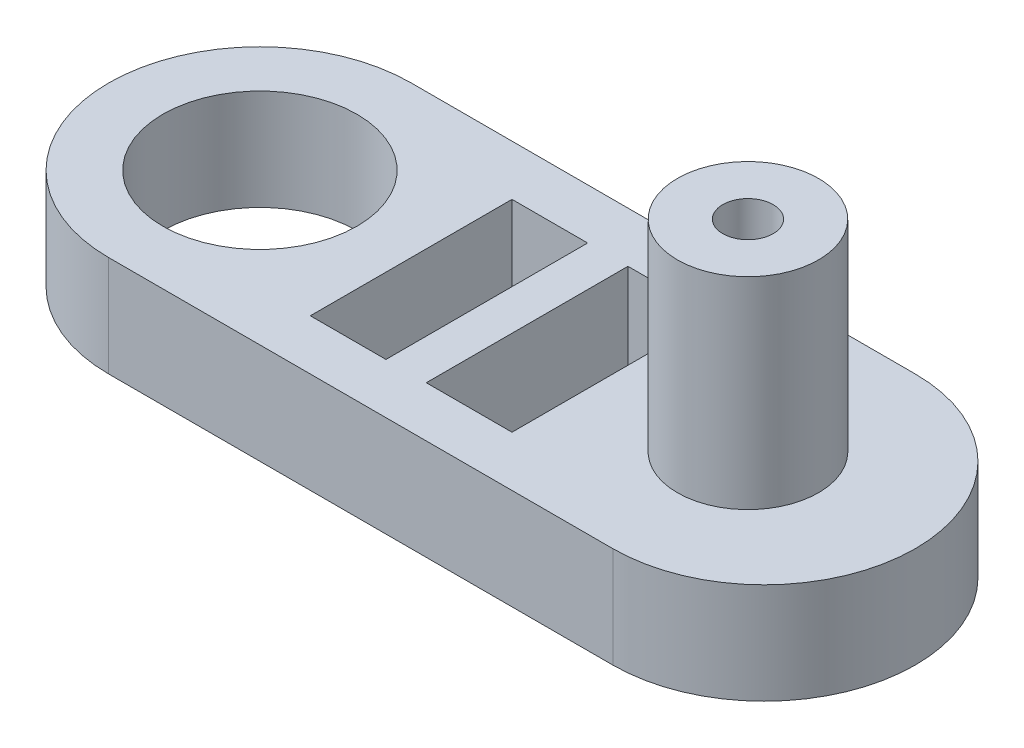
ISO-10303-21;
HEADER;
FILE_DESCRIPTION(('STEP AP214'),'2;1');
FILE_NAME('part.step','',(''),(''),'','','');
FILE_SCHEMA(('AUTOMOTIVE_DESIGN { 1 0 10303 214 1 1 1 1 }'));
ENDSEC;
DATA;
#1=APPLICATION_CONTEXT('core data for automotive mechanical design processes');
#2=APPLICATION_PROTOCOL_DEFINITION('international standard','automotive_design',2000,#1);
#3=PRODUCT_CONTEXT('',#1,'mechanical');
#4=PRODUCT('Part','Part','',(#3));
#5=PRODUCT_RELATED_PRODUCT_CATEGORY('part','',(#4));
#6=PRODUCT_DEFINITION_FORMATION('','',#4);
#7=PRODUCT_DEFINITION_CONTEXT('part definition',#1,'design');
#8=PRODUCT_DEFINITION('design','',#6,#7);
#9=PRODUCT_DEFINITION_SHAPE('','',#8);
#10=(LENGTH_UNIT() NAMED_UNIT(*) SI_UNIT(.MILLI.,.METRE.));
#11=(NAMED_UNIT(*) PLANE_ANGLE_UNIT() SI_UNIT($,.RADIAN.));
#12=(NAMED_UNIT(*) SI_UNIT($,.STERADIAN.) SOLID_ANGLE_UNIT());
#13=UNCERTAINTY_MEASURE_WITH_UNIT(LENGTH_MEASURE(1.E-05),#10,'distance_accuracy_value','');
#14=(GEOMETRIC_REPRESENTATION_CONTEXT(3) GLOBAL_UNCERTAINTY_ASSIGNED_CONTEXT((#13)) GLOBAL_UNIT_ASSIGNED_CONTEXT((#10,
#11,#12)) REPRESENTATION_CONTEXT('',''));
#15=CARTESIAN_POINT('',(0.,0.,0.));
#16=DIRECTION('',(0.,0.,1.));
#17=DIRECTION('',(1.,0.,0.));
#18=AXIS2_PLACEMENT_3D('',#15,#16,#17);
#19=CARTESIAN_POINT('',(-33.4000143814819,0.,-10.));
#20=DIRECTION('',(0.,0.,-1.));
#21=DIRECTION('',(-1.,0.,0.));
#22=AXIS2_PLACEMENT_3D('',#19,#20,#21);
#23=PLANE('',#22);
#24=DIRECTION('',(0.,1.,0.));
#25=VECTOR('',#24,1.);
#26=CARTESIAN_POINT('',(-21.9000143814819,10.,-10.));
#27=LINE('',#26,#25);
#28=CARTESIAN_POINT('',(-21.9000143814819,0.,-10.));
#29=VERTEX_POINT('',#28);
#30=CARTESIAN_POINT('',(-21.9000143814819,10.,-10.));
#31=VERTEX_POINT('',#30);
#32=EDGE_CURVE('E131',#29,#31,#27,.T.);
#33=ORIENTED_EDGE('',*,*,#32,.F.);
#34=DIRECTION('',(-1.,0.,0.));
#35=VECTOR('',#34,1.);
#36=CARTESIAN_POINT('',(-33.4000143814819,0.,-10.));
#37=LINE('',#36,#35);
#38=CARTESIAN_POINT('',(-13.4000143814819,0.,-10.));
#39=VERTEX_POINT('',#38);
#40=EDGE_CURVE('E167',#39,#29,#37,.T.);
#41=ORIENTED_EDGE('',*,*,#40,.F.);
#42=DIRECTION('',(0.,1.,0.));
#43=VECTOR('',#42,1.);
#44=CARTESIAN_POINT('',(-13.4000143814819,0.,-10.));
#45=LINE('',#44,#43);
#46=CARTESIAN_POINT('',(-13.4000143814819,10.,-10.));
#47=VERTEX_POINT('',#46);
#48=EDGE_CURVE('E159',#39,#47,#45,.T.);
#49=ORIENTED_EDGE('',*,*,#48,.T.);
#50=DIRECTION('',(-1.,0.,0.));
#51=VECTOR('',#50,1.);
#52=CARTESIAN_POINT('',(-33.4000143814819,10.,-10.));
#53=LINE('',#52,#51);
#54=EDGE_CURVE('E146',#47,#31,#53,.T.);
#55=ORIENTED_EDGE('',*,*,#54,.T.);
#56=EDGE_LOOP('',(#33,#41,#49,#55));
#57=FACE_BOUND('',#56,.T.);
#58=ADVANCED_FACE('F35',(#57),#23,.F.);
#59=DIRECTION('',(0.,-1.,0.));
#60=VECTOR('',#59,1.);
#61=CARTESIAN_POINT('',(-25.9000143814819,10.,-10.));
#62=LINE('',#61,#60);
#63=CARTESIAN_POINT('',(-25.9000143814819,10.,-10.));
#64=VERTEX_POINT('',#63);
#65=CARTESIAN_POINT('',(-25.9000143814819,0.,-10.));
#66=VERTEX_POINT('',#65);
#67=EDGE_CURVE('E50',#64,#66,#62,.T.);
#68=ORIENTED_EDGE('',*,*,#67,.F.);
#69=CARTESIAN_POINT('',(-33.4000143814819,10.,-10.));
#70=VERTEX_POINT('',#69);
#71=EDGE_CURVE('E137',#64,#70,#53,.T.);
#72=ORIENTED_EDGE('',*,*,#71,.T.);
#73=DIRECTION('',(0.,1.,0.));
#74=VECTOR('',#73,1.);
#75=CARTESIAN_POINT('',(-33.4000143814819,0.,-10.));
#76=LINE('',#75,#74);
#77=CARTESIAN_POINT('',(-33.4000143814819,0.,-10.));
#78=VERTEX_POINT('',#77);
#79=EDGE_CURVE('E156',#78,#70,#76,.T.);
#80=ORIENTED_EDGE('',*,*,#79,.F.);
#81=EDGE_CURVE('E139',#66,#78,#37,.T.);
#82=ORIENTED_EDGE('',*,*,#81,.F.);
#83=EDGE_LOOP('',(#68,#72,#80,#82));
#84=FACE_BOUND('',#83,.T.);
#85=ADVANCED_FACE('F135',(#84),#23,.F.);
#86=CARTESIAN_POINT('',(-33.4000143814819,0.,10.));
#87=DIRECTION('',(0.,0.,1.));
#88=DIRECTION('',(1.,0.,0.));
#89=AXIS2_PLACEMENT_3D('',#86,#87,#88);
#90=PLANE('',#89);
#91=DIRECTION('',(0.,1.,0.));
#92=VECTOR('',#91,1.);
#93=CARTESIAN_POINT('',(-21.9000143814819,10.,10.));
#94=LINE('',#93,#92);
#95=CARTESIAN_POINT('',(-21.9000143814819,0.,10.));
#96=VERTEX_POINT('',#95);
#97=CARTESIAN_POINT('',(-21.9000143814819,10.,10.));
#98=VERTEX_POINT('',#97);
#99=EDGE_CURVE('E400',#96,#98,#94,.T.);
#100=ORIENTED_EDGE('',*,*,#99,.T.);
#101=DIRECTION('',(1.,0.,0.));
#102=VECTOR('',#101,1.);
#103=CARTESIAN_POINT('',(-33.4000143814819,10.,10.));
#104=LINE('',#103,#102);
#105=CARTESIAN_POINT('',(-13.4000143814819,10.,10.));
#106=VERTEX_POINT('',#105);
#107=EDGE_CURVE('E413',#98,#106,#104,.T.);
#108=ORIENTED_EDGE('',*,*,#107,.T.);
#109=DIRECTION('',(0.,1.,0.));
#110=VECTOR('',#109,1.);
#111=CARTESIAN_POINT('',(-13.4000143814819,0.,10.));
#112=LINE('',#111,#110);
#113=CARTESIAN_POINT('',(-13.4000143814819,0.,10.));
#114=VERTEX_POINT('',#113);
#115=EDGE_CURVE('E161',#114,#106,#112,.T.);
#116=ORIENTED_EDGE('',*,*,#115,.F.);
#117=DIRECTION('',(1.,0.,0.));
#118=VECTOR('',#117,1.);
#119=CARTESIAN_POINT('',(-33.4000143814819,0.,10.));
#120=LINE('',#119,#118);
#121=EDGE_CURVE('E406',#96,#114,#120,.T.);
#122=ORIENTED_EDGE('',*,*,#121,.F.);
#123=EDGE_LOOP('',(#100,#108,#116,#122));
#124=FACE_BOUND('',#123,.T.);
#125=ADVANCED_FACE('F231',(#124),#90,.F.);
#126=DIRECTION('',(0.,-1.,0.));
#127=VECTOR('',#126,1.);
#128=CARTESIAN_POINT('',(-25.9000143814819,10.,10.));
#129=LINE('',#128,#127);
#130=CARTESIAN_POINT('',(-25.9000143814819,10.,10.));
#131=VERTEX_POINT('',#130);
#132=CARTESIAN_POINT('',(-25.9000143814819,0.,10.));
#133=VERTEX_POINT('',#132);
#134=EDGE_CURVE('E125',#131,#133,#129,.T.);
#135=ORIENTED_EDGE('',*,*,#134,.T.);
#136=CARTESIAN_POINT('',(-33.4000143814819,0.,10.));
#137=VERTEX_POINT('',#136);
#138=EDGE_CURVE('E398',#137,#133,#120,.T.);
#139=ORIENTED_EDGE('',*,*,#138,.F.);
#140=DIRECTION('',(0.,1.,0.));
#141=VECTOR('',#140,1.);
#142=CARTESIAN_POINT('',(-33.4000143814819,0.,10.));
#143=LINE('',#142,#141);
#144=CARTESIAN_POINT('',(-33.4000143814819,10.,10.));
#145=VERTEX_POINT('',#144);
#146=EDGE_CURVE('E164',#137,#145,#143,.T.);
#147=ORIENTED_EDGE('',*,*,#146,.T.);
#148=EDGE_CURVE('E152',#145,#131,#104,.T.);
#149=ORIENTED_EDGE('',*,*,#148,.T.);
#150=EDGE_LOOP('',(#135,#139,#147,#149));
#151=FACE_BOUND('',#150,.T.);
#152=ADVANCED_FACE('F244',(#151),#90,.F.);
#153=CARTESIAN_POINT('',(-48.4000143814819,10.,0.));
#154=DIRECTION('',(0.,1.,0.));
#155=DIRECTION('',(0.,0.,1.));
#156=AXIS2_PLACEMENT_3D('',#153,#154,#155);
#157=PLANE('',#156);
#158=CARTESIAN_POINT('',(0.,10.,0.));
#159=DIRECTION('',(0.,1.,0.));
#160=DIRECTION('',(0.,0.,1.));
#161=AXIS2_PLACEMENT_3D('',#158,#159,#160);
#162=CIRCLE('',#161,7.);
#163=CARTESIAN_POINT('',(0.,10.,7.));
#164=VERTEX_POINT('',#163);
#165=EDGE_CURVE('E429',#164,#164,#162,.T.);
#166=ORIENTED_EDGE('',*,*,#165,.F.);
#167=EDGE_LOOP('',(#166));
#168=FACE_BOUND('',#167,.T.);
#169=ORIENTED_EDGE('',*,*,#71,.F.);
#170=DIRECTION('',(0.,0.,-1.));
#171=VECTOR('',#170,1.);
#172=CARTESIAN_POINT('',(-25.9000143814819,10.,15.002));
#173=LINE('',#172,#171);
#174=EDGE_CURVE('E122',#131,#64,#173,.T.);
#175=ORIENTED_EDGE('',*,*,#174,.F.);
#176=ORIENTED_EDGE('',*,*,#148,.F.);
#177=DIRECTION('',(0.,0.,1.));
#178=VECTOR('',#177,1.);
#179=CARTESIAN_POINT('',(-33.4000143814819,10.,-10.));
#180=LINE('',#179,#178);
#181=EDGE_CURVE('E145',#70,#145,#180,.T.);
#182=ORIENTED_EDGE('',*,*,#181,.F.);
#183=EDGE_LOOP('',(#169,#175,#176,#182));
#184=FACE_BOUND('',#183,.T.);
#185=DIRECTION('',(0.,0.,-1.));
#186=VECTOR('',#185,1.);
#187=CARTESIAN_POINT('',(-21.9000143814819,10.,15.002));
#188=LINE('',#187,#186);
#189=EDGE_CURVE('E130',#98,#31,#188,.T.);
#190=ORIENTED_EDGE('',*,*,#189,.T.);
#191=ORIENTED_EDGE('',*,*,#54,.F.);
#192=DIRECTION('',(0.,0.,-1.));
#193=VECTOR('',#192,1.);
#194=CARTESIAN_POINT('',(-13.4000143814819,10.,-10.));
#195=LINE('',#194,#193);
#196=EDGE_CURVE('E147',#106,#47,#195,.T.);
#197=ORIENTED_EDGE('',*,*,#196,.F.);
#198=ORIENTED_EDGE('',*,*,#107,.F.);
#199=EDGE_LOOP('',(#190,#191,#197,#198));
#200=FACE_BOUND('',#199,.T.);
#201=CARTESIAN_POINT('',(-48.4000143814819,10.,0.));
#202=DIRECTION('',(0.,1.,0.));
#203=DIRECTION('',(0.,0.,1.));
#204=AXIS2_PLACEMENT_3D('',#201,#202,#203);
#205=CIRCLE('',#204,15.);
#206=CARTESIAN_POINT('',(-48.4000143814819,10.,-15.));
#207=VERTEX_POINT('',#206);
#208=CARTESIAN_POINT('',(-48.4000143814819,10.,15.));
#209=VERTEX_POINT('',#208);
#210=EDGE_CURVE('E174',#207,#209,#205,.T.);
#211=ORIENTED_EDGE('',*,*,#210,.T.);
#212=DIRECTION('',(1.,0.,0.));
#213=VECTOR('',#212,1.);
#214=CARTESIAN_POINT('',(-48.4000143814819,10.,15.));
#215=LINE('',#214,#213);
#216=CARTESIAN_POINT('',(1.59998561851808,10.,15.));
#217=VERTEX_POINT('',#216);
#218=EDGE_CURVE('E177',#209,#217,#215,.T.);
#219=ORIENTED_EDGE('',*,*,#218,.T.);
#220=CARTESIAN_POINT('',(1.59998561851808,10.,0.));
#221=DIRECTION('',(0.,1.,0.));
#222=DIRECTION('',(0.,0.,1.));
#223=AXIS2_PLACEMENT_3D('',#220,#221,#222);
#224=CIRCLE('',#223,15.);
#225=CARTESIAN_POINT('',(1.59998561851808,10.,-15.));
#226=VERTEX_POINT('',#225);
#227=EDGE_CURVE('E180',#217,#226,#224,.T.);
#228=ORIENTED_EDGE('',*,*,#227,.T.);
#229=DIRECTION('',(-1.,0.,0.));
#230=VECTOR('',#229,1.);
#231=CARTESIAN_POINT('',(-48.4000143814819,10.,-15.));
#232=LINE('',#231,#230);
#233=EDGE_CURVE('E182',#226,#207,#232,.T.);
#234=ORIENTED_EDGE('',*,*,#233,.T.);
#235=EDGE_LOOP('',(#211,#219,#228,#234));
#236=FACE_BOUND('',#235,.T.);
#237=CARTESIAN_POINT('',(-48.4000143814819,10.,0.));
#238=DIRECTION('',(0.,1.,0.));
#239=DIRECTION('',(0.,0.,1.));
#240=AXIS2_PLACEMENT_3D('',#237,#238,#239);
#241=CIRCLE('',#240,9.625);
#242=CARTESIAN_POINT('',(-48.4000143814819,10.,9.625));
#243=VERTEX_POINT('',#242);
#244=EDGE_CURVE('E168',#243,#243,#241,.T.);
#245=ORIENTED_EDGE('',*,*,#244,.F.);
#246=EDGE_LOOP('',(#245));
#247=FACE_BOUND('',#246,.T.);
#248=ADVANCED_FACE('F143',(#168,#184,#200,#236,#247),#157,.T.);
#249=CARTESIAN_POINT('',(-48.4000143814819,0.,0.));
#250=DIRECTION('',(0.,1.,0.));
#251=DIRECTION('',(0.,0.,1.));
#252=AXIS2_PLACEMENT_3D('',#249,#250,#251);
#253=PLANE('',#252);
#254=ORIENTED_EDGE('',*,*,#40,.T.);
#255=DIRECTION('',(0.,0.,-1.));
#256=VECTOR('',#255,1.);
#257=CARTESIAN_POINT('',(-21.9000143814819,0.,15.002));
#258=LINE('',#257,#256);
#259=EDGE_CURVE('E58',#96,#29,#258,.T.);
#260=ORIENTED_EDGE('',*,*,#259,.F.);
#261=ORIENTED_EDGE('',*,*,#121,.T.);
#262=DIRECTION('',(0.,0.,-1.));
#263=VECTOR('',#262,1.);
#264=CARTESIAN_POINT('',(-13.4000143814819,0.,-10.));
#265=LINE('',#264,#263);
#266=EDGE_CURVE('E405',#114,#39,#265,.T.);
#267=ORIENTED_EDGE('',*,*,#266,.T.);
#268=EDGE_LOOP('',(#254,#260,#261,#267));
#269=FACE_BOUND('',#268,.T.);
#270=DIRECTION('',(0.,0.,-1.));
#271=VECTOR('',#270,1.);
#272=CARTESIAN_POINT('',(-25.9000143814819,0.,15.002));
#273=LINE('',#272,#271);
#274=EDGE_CURVE('E401',#133,#66,#273,.T.);
#275=ORIENTED_EDGE('',*,*,#274,.T.);
#276=ORIENTED_EDGE('',*,*,#81,.T.);
#277=DIRECTION('',(0.,0.,1.));
#278=VECTOR('',#277,1.);
#279=CARTESIAN_POINT('',(-33.4000143814819,0.,-10.));
#280=LINE('',#279,#278);
#281=EDGE_CURVE('E150',#78,#137,#280,.T.);
#282=ORIENTED_EDGE('',*,*,#281,.T.);
#283=ORIENTED_EDGE('',*,*,#138,.T.);
#284=EDGE_LOOP('',(#275,#276,#282,#283));
#285=FACE_BOUND('',#284,.T.);
#286=CARTESIAN_POINT('',(-48.4000143814819,0.,0.));
#287=DIRECTION('',(0.,1.,0.));
#288=DIRECTION('',(0.,0.,1.));
#289=AXIS2_PLACEMENT_3D('',#286,#287,#288);
#290=CIRCLE('',#289,15.);
#291=CARTESIAN_POINT('',(-48.4000143814819,0.,-15.));
#292=VERTEX_POINT('',#291);
#293=CARTESIAN_POINT('',(-48.4000143814819,0.,15.));
#294=VERTEX_POINT('',#293);
#295=EDGE_CURVE('E171',#292,#294,#290,.T.);
#296=ORIENTED_EDGE('',*,*,#295,.F.);
#297=DIRECTION('',(-1.,0.,0.));
#298=VECTOR('',#297,1.);
#299=CARTESIAN_POINT('',(-48.4000143814819,0.,-15.));
#300=LINE('',#299,#298);
#301=CARTESIAN_POINT('',(1.59998561851808,0.,-15.));
#302=VERTEX_POINT('',#301);
#303=EDGE_CURVE('E178',#302,#292,#300,.T.);
#304=ORIENTED_EDGE('',*,*,#303,.F.);
#305=CARTESIAN_POINT('',(1.59998561851808,0.,0.));
#306=DIRECTION('',(0.,1.,0.));
#307=DIRECTION('',(0.,0.,1.));
#308=AXIS2_PLACEMENT_3D('',#305,#306,#307);
#309=CIRCLE('',#308,15.);
#310=CARTESIAN_POINT('',(1.59998561851808,0.,15.));
#311=VERTEX_POINT('',#310);
#312=EDGE_CURVE('E189',#311,#302,#309,.T.);
#313=ORIENTED_EDGE('',*,*,#312,.F.);
#314=DIRECTION('',(1.,0.,0.));
#315=VECTOR('',#314,1.);
#316=CARTESIAN_POINT('',(-48.4000143814819,0.,15.));
#317=LINE('',#316,#315);
#318=EDGE_CURVE('E187',#294,#311,#317,.T.);
#319=ORIENTED_EDGE('',*,*,#318,.F.);
#320=EDGE_LOOP('',(#296,#304,#313,#319));
#321=FACE_BOUND('',#320,.T.);
#322=CARTESIAN_POINT('',(-48.4000143814819,0.,0.));
#323=DIRECTION('',(0.,1.,0.));
#324=DIRECTION('',(0.,0.,1.));
#325=AXIS2_PLACEMENT_3D('',#322,#323,#324);
#326=CIRCLE('',#325,9.625);
#327=CARTESIAN_POINT('',(-48.4000143814819,0.,9.625));
#328=VERTEX_POINT('',#327);
#329=EDGE_CURVE('E158',#328,#328,#326,.T.);
#330=ORIENTED_EDGE('',*,*,#329,.T.);
#331=EDGE_LOOP('',(#330));
#332=FACE_BOUND('',#331,.T.);
#333=ADVANCED_FACE('F207',(#269,#285,#321,#332),#253,.F.);
#334=CARTESIAN_POINT('',(-48.4000143814819,10.,0.));
#335=DIRECTION('',(0.,-1.,0.));
#336=DIRECTION('',(0.,0.,-1.));
#337=AXIS2_PLACEMENT_3D('',#334,#335,#336);
#338=CYLINDRICAL_SURFACE('',#337,15.);
#339=ORIENTED_EDGE('',*,*,#295,.T.);
#340=DIRECTION('',(0.,-1.,0.));
#341=VECTOR('',#340,1.);
#342=CARTESIAN_POINT('',(-48.4000143814819,10.,15.));
#343=LINE('',#342,#341);
#344=EDGE_CURVE('E11',#209,#294,#343,.T.);
#345=ORIENTED_EDGE('',*,*,#344,.F.);
#346=ORIENTED_EDGE('',*,*,#210,.F.);
#347=DIRECTION('',(0.,-1.,0.));
#348=VECTOR('',#347,1.);
#349=CARTESIAN_POINT('',(-48.4000143814819,10.,-15.));
#350=LINE('',#349,#348);
#351=EDGE_CURVE('E184',#207,#292,#350,.T.);
#352=ORIENTED_EDGE('',*,*,#351,.T.);
#353=EDGE_LOOP('',(#339,#345,#346,#352));
#354=FACE_BOUND('',#353,.T.);
#355=ADVANCED_FACE('F37',(#354),#338,.T.);
#356=CARTESIAN_POINT('',(-48.4000143814819,10.,15.));
#357=DIRECTION('',(0.,0.,-1.));
#358=DIRECTION('',(-1.,0.,0.));
#359=AXIS2_PLACEMENT_3D('',#356,#357,#358);
#360=PLANE('',#359);
#361=ORIENTED_EDGE('',*,*,#318,.T.);
#362=DIRECTION('',(0.,-1.,0.));
#363=VECTOR('',#362,1.);
#364=CARTESIAN_POINT('',(1.59998561851808,10.,15.));
#365=LINE('',#364,#363);
#366=EDGE_CURVE('E43',#217,#311,#365,.T.);
#367=ORIENTED_EDGE('',*,*,#366,.F.);
#368=ORIENTED_EDGE('',*,*,#218,.F.);
#369=ORIENTED_EDGE('',*,*,#344,.T.);
#370=EDGE_LOOP('',(#361,#367,#368,#369));
#371=FACE_BOUND('',#370,.T.);
#372=ADVANCED_FACE('F218',(#371),#360,.F.);
#373=CARTESIAN_POINT('',(1.59998561851808,10.,0.));
#374=DIRECTION('',(0.,-1.,0.));
#375=DIRECTION('',(0.,0.,-1.));
#376=AXIS2_PLACEMENT_3D('',#373,#374,#375);
#377=CYLINDRICAL_SURFACE('',#376,15.);
#378=ORIENTED_EDGE('',*,*,#312,.T.);
#379=DIRECTION('',(0.,-1.,0.));
#380=VECTOR('',#379,1.);
#381=CARTESIAN_POINT('',(1.59998561851808,10.,-15.));
#382=LINE('',#381,#380);
#383=EDGE_CURVE('E194',#226,#302,#382,.T.);
#384=ORIENTED_EDGE('',*,*,#383,.F.);
#385=ORIENTED_EDGE('',*,*,#227,.F.);
#386=ORIENTED_EDGE('',*,*,#366,.T.);
#387=EDGE_LOOP('',(#378,#384,#385,#386));
#388=FACE_BOUND('',#387,.T.);
#389=ADVANCED_FACE('F201',(#388),#377,.T.);
#390=CARTESIAN_POINT('',(-48.4000143814819,10.,-15.));
#391=DIRECTION('',(0.,0.,1.));
#392=DIRECTION('',(1.,0.,0.));
#393=AXIS2_PLACEMENT_3D('',#390,#391,#392);
#394=PLANE('',#393);
#395=ORIENTED_EDGE('',*,*,#303,.T.);
#396=ORIENTED_EDGE('',*,*,#351,.F.);
#397=ORIENTED_EDGE('',*,*,#233,.F.);
#398=ORIENTED_EDGE('',*,*,#383,.T.);
#399=EDGE_LOOP('',(#395,#396,#397,#398));
#400=FACE_BOUND('',#399,.T.);
#401=ADVANCED_FACE('F211',(#400),#394,.F.);
#402=CARTESIAN_POINT('',(-48.4000143814819,10.,0.));
#403=DIRECTION('',(0.,-1.,0.));
#404=DIRECTION('',(0.,0.,-1.));
#405=AXIS2_PLACEMENT_3D('',#402,#403,#404);
#406=CYLINDRICAL_SURFACE('',#405,9.625);
#407=ORIENTED_EDGE('',*,*,#244,.T.);
#408=EDGE_LOOP('',(#407));
#409=FACE_BOUND('',#408,.T.);
#410=ORIENTED_EDGE('',*,*,#329,.F.);
#411=EDGE_LOOP('',(#410));
#412=FACE_BOUND('',#411,.T.);
#413=ADVANCED_FACE('F248',(#409,#412),#406,.F.);
#414=CARTESIAN_POINT('',(-33.4000143814819,0.,-10.));
#415=DIRECTION('',(-1.,0.,0.));
#416=DIRECTION('',(0.,0.,1.));
#417=AXIS2_PLACEMENT_3D('',#414,#415,#416);
#418=PLANE('',#417);
#419=ORIENTED_EDGE('',*,*,#181,.T.);
#420=ORIENTED_EDGE('',*,*,#146,.F.);
#421=ORIENTED_EDGE('',*,*,#281,.F.);
#422=ORIENTED_EDGE('',*,*,#79,.T.);
#423=EDGE_LOOP('',(#419,#420,#421,#422));
#424=FACE_BOUND('',#423,.T.);
#425=ADVANCED_FACE('F240',(#424),#418,.F.);
#426=CARTESIAN_POINT('',(-13.4000143814819,0.,-10.));
#427=DIRECTION('',(1.,0.,0.));
#428=DIRECTION('',(0.,0.,-1.));
#429=AXIS2_PLACEMENT_3D('',#426,#427,#428);
#430=PLANE('',#429);
#431=ORIENTED_EDGE('',*,*,#196,.T.);
#432=ORIENTED_EDGE('',*,*,#48,.F.);
#433=ORIENTED_EDGE('',*,*,#266,.F.);
#434=ORIENTED_EDGE('',*,*,#115,.T.);
#435=EDGE_LOOP('',(#431,#432,#433,#434));
#436=FACE_BOUND('',#435,.T.);
#437=ADVANCED_FACE('F236',(#436),#430,.F.);
#438=CARTESIAN_POINT('',(-21.9000143814819,10.,15.002));
#439=DIRECTION('',(-1.,0.,0.));
#440=DIRECTION('',(0.,-1.,0.));
#441=AXIS2_PLACEMENT_3D('',#438,#439,#440);
#442=PLANE('',#441);
#443=ORIENTED_EDGE('',*,*,#99,.F.);
#444=ORIENTED_EDGE('',*,*,#259,.T.);
#445=ORIENTED_EDGE('',*,*,#32,.T.);
#446=ORIENTED_EDGE('',*,*,#189,.F.);
#447=EDGE_LOOP('',(#443,#444,#445,#446));
#448=FACE_BOUND('',#447,.T.);
#449=ADVANCED_FACE('F239',(#448),#442,.F.);
#450=CARTESIAN_POINT('',(-25.9000143814819,10.,15.002));
#451=DIRECTION('',(1.,0.,0.));
#452=DIRECTION('',(0.,0.,-1.));
#453=AXIS2_PLACEMENT_3D('',#450,#451,#452);
#454=PLANE('',#453);
#455=ORIENTED_EDGE('',*,*,#134,.F.);
#456=ORIENTED_EDGE('',*,*,#174,.T.);
#457=ORIENTED_EDGE('',*,*,#67,.T.);
#458=ORIENTED_EDGE('',*,*,#274,.F.);
#459=EDGE_LOOP('',(#455,#456,#457,#458));
#460=FACE_BOUND('',#459,.T.);
#461=ADVANCED_FACE('F123',(#460),#454,.F.);
#462=CARTESIAN_POINT('',(0.,30.,0.));
#463=DIRECTION('',(0.,-1.,0.));
#464=DIRECTION('',(0.,0.,-1.));
#465=AXIS2_PLACEMENT_3D('',#462,#463,#464);
#466=CYLINDRICAL_SURFACE('',#465,7.);
#467=CARTESIAN_POINT('',(0.,30.,0.));
#468=DIRECTION('',(0.,1.,0.));
#469=DIRECTION('',(0.,0.,1.));
#470=AXIS2_PLACEMENT_3D('',#467,#468,#469);
#471=CIRCLE('',#470,7.);
#472=CARTESIAN_POINT('',(0.,30.,7.));
#473=VERTEX_POINT('',#472);
#474=EDGE_CURVE('E140',#473,#473,#471,.T.);
#475=ORIENTED_EDGE('',*,*,#474,.F.);
#476=EDGE_LOOP('',(#475));
#477=FACE_BOUND('',#476,.T.);
#478=ORIENTED_EDGE('',*,*,#165,.T.);
#479=EDGE_LOOP('',(#478));
#480=FACE_BOUND('',#479,.T.);
#481=ADVANCED_FACE('F282',(#477,#480),#466,.T.);
#482=CARTESIAN_POINT('',(0.,30.,0.));
#483=DIRECTION('',(0.,1.,0.));
#484=DIRECTION('',(0.,0.,1.));
#485=AXIS2_PLACEMENT_3D('',#482,#483,#484);
#486=PLANE('',#485);
#487=CARTESIAN_POINT('',(0.,30.,0.));
#488=DIRECTION('',(0.,1.,0.));
#489=DIRECTION('',(0.,0.,1.));
#490=AXIS2_PLACEMENT_3D('',#487,#488,#489);
#491=CIRCLE('',#490,2.5);
#492=CARTESIAN_POINT('',(0.,30.,2.5));
#493=VERTEX_POINT('',#492);
#494=EDGE_CURVE('E435',#493,#493,#491,.T.);
#495=ORIENTED_EDGE('',*,*,#494,.F.);
#496=EDGE_LOOP('',(#495));
#497=FACE_BOUND('',#496,.T.);
#498=ORIENTED_EDGE('',*,*,#474,.T.);
#499=EDGE_LOOP('',(#498));
#500=FACE_BOUND('',#499,.T.);
#501=ADVANCED_FACE('F295',(#497,#500),#486,.T.);
#502=CARTESIAN_POINT('',(0.,20.,0.));
#503=DIRECTION('',(0.,1.,0.));
#504=DIRECTION('',(0.,0.,1.));
#505=AXIS2_PLACEMENT_3D('',#502,#503,#504);
#506=CYLINDRICAL_SURFACE('',#505,2.5);
#507=CARTESIAN_POINT('',(0.,20.,0.));
#508=DIRECTION('',(0.,1.,0.));
#509=DIRECTION('',(0.,0.,1.));
#510=AXIS2_PLACEMENT_3D('',#507,#508,#509);
#511=CIRCLE('',#510,2.5);
#512=CARTESIAN_POINT('',(0.,20.,2.5));
#513=VERTEX_POINT('',#512);
#514=EDGE_CURVE('E432',#513,#513,#511,.T.);
#515=ORIENTED_EDGE('',*,*,#514,.F.);
#516=EDGE_LOOP('',(#515));
#517=FACE_BOUND('',#516,.T.);
#518=ORIENTED_EDGE('',*,*,#494,.T.);
#519=EDGE_LOOP('',(#518));
#520=FACE_BOUND('',#519,.T.);
#521=ADVANCED_FACE('F303',(#517,#520),#506,.F.);
#522=CARTESIAN_POINT('',(0.,20.,0.));
#523=DIRECTION('',(0.,1.,0.));
#524=DIRECTION('',(0.,0.,1.));
#525=AXIS2_PLACEMENT_3D('',#522,#523,#524);
#526=PLANE('',#525);
#527=ORIENTED_EDGE('',*,*,#514,.T.);
#528=EDGE_LOOP('',(#527));
#529=FACE_BOUND('',#528,.T.);
#530=ADVANCED_FACE('F311',(#529),#526,.T.);
#531=CLOSED_SHELL('',(#58,#85,#125,#152,#248,#333,#355,#372,#389,#401,#413,#425,#437,#449,#461,
#481,#501,#521,#530));
#532=MANIFOLD_SOLID_BREP('B2',#531);
#533=ADVANCED_BREP_SHAPE_REPRESENTATION('',(#18,#532),#14);
#534=SHAPE_DEFINITION_REPRESENTATION(#9,#533);
ENDSEC;
END-ISO-10303-21;
